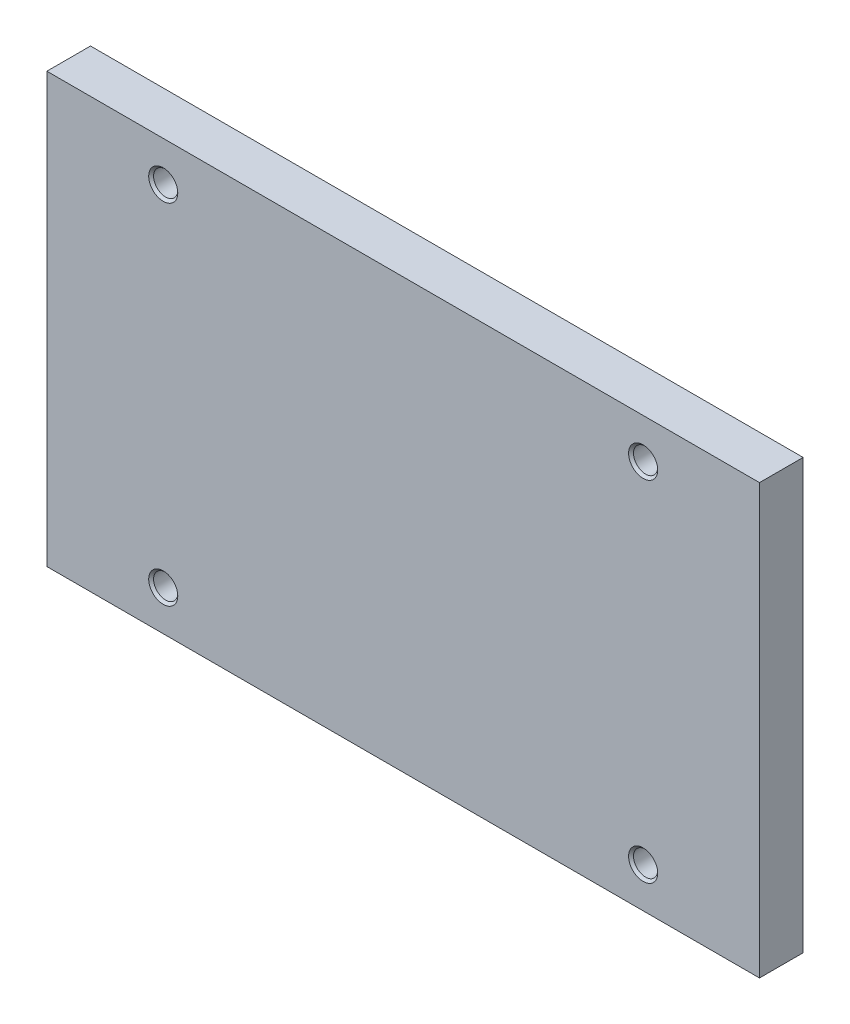
ISO-10303-21;
HEADER;
FILE_DESCRIPTION(('STEP AP214'),'2;1');
FILE_NAME('part.step','',(''),(''),'','','');
FILE_SCHEMA(('AUTOMOTIVE_DESIGN { 1 0 10303 214 1 1 1 1 }'));
ENDSEC;
DATA;
#1=APPLICATION_CONTEXT('core data for automotive mechanical design processes');
#2=APPLICATION_PROTOCOL_DEFINITION('international standard','automotive_design',2000,#1);
#3=PRODUCT_CONTEXT('',#1,'mechanical');
#4=PRODUCT('Part','Part','',(#3));
#5=PRODUCT_RELATED_PRODUCT_CATEGORY('part','',(#4));
#6=PRODUCT_DEFINITION_FORMATION('','',#4);
#7=PRODUCT_DEFINITION_CONTEXT('part definition',#1,'design');
#8=PRODUCT_DEFINITION('design','',#6,#7);
#9=PRODUCT_DEFINITION_SHAPE('','',#8);
#10=(LENGTH_UNIT() NAMED_UNIT(*) SI_UNIT(.MILLI.,.METRE.));
#11=(NAMED_UNIT(*) PLANE_ANGLE_UNIT() SI_UNIT($,.RADIAN.));
#12=(NAMED_UNIT(*) SI_UNIT($,.STERADIAN.) SOLID_ANGLE_UNIT());
#13=UNCERTAINTY_MEASURE_WITH_UNIT(LENGTH_MEASURE(1.E-05),#10,'distance_accuracy_value','');
#14=(GEOMETRIC_REPRESENTATION_CONTEXT(3) GLOBAL_UNCERTAINTY_ASSIGNED_CONTEXT((#13)) GLOBAL_UNIT_ASSIGNED_CONTEXT((#10,
#11,#12)) REPRESENTATION_CONTEXT('',''));
#15=CARTESIAN_POINT('',(0.,0.,0.));
#16=DIRECTION('',(0.,0.,1.));
#17=DIRECTION('',(1.,0.,0.));
#18=AXIS2_PLACEMENT_3D('',#15,#16,#17);
#19=CARTESIAN_POINT('',(98.,-59.,0.));
#20=DIRECTION('',(1.,0.,0.));
#21=DIRECTION('',(0.,0.,-1.));
#22=AXIS2_PLACEMENT_3D('',#19,#20,#21);
#23=PLANE('',#22);
#24=DIRECTION('',(0.,1.,0.));
#25=VECTOR('',#24,1.);
#26=CARTESIAN_POINT('',(98.,-59.,12.));
#27=LINE('',#26,#25);
#28=CARTESIAN_POINT('',(98.,-59.,12.));
#29=VERTEX_POINT('',#28);
#30=CARTESIAN_POINT('',(98.,59.,12.));
#31=VERTEX_POINT('',#30);
#32=EDGE_CURVE('E108',#29,#31,#27,.T.);
#33=ORIENTED_EDGE('',*,*,#32,.F.);
#34=DIRECTION('',(0.,0.,1.));
#35=VECTOR('',#34,1.);
#36=CARTESIAN_POINT('',(98.,-59.,0.));
#37=LINE('',#36,#35);
#38=CARTESIAN_POINT('',(98.,-59.,0.));
#39=VERTEX_POINT('',#38);
#40=EDGE_CURVE('E57',#39,#29,#37,.T.);
#41=ORIENTED_EDGE('',*,*,#40,.F.);
#42=DIRECTION('',(0.,1.,0.));
#43=VECTOR('',#42,1.);
#44=CARTESIAN_POINT('',(98.,-59.,0.));
#45=LINE('',#44,#43);
#46=CARTESIAN_POINT('',(98.,59.,0.));
#47=VERTEX_POINT('',#46);
#48=EDGE_CURVE('E102',#39,#47,#45,.T.);
#49=ORIENTED_EDGE('',*,*,#48,.T.);
#50=DIRECTION('',(0.,0.,1.));
#51=VECTOR('',#50,1.);
#52=CARTESIAN_POINT('',(98.,59.,0.));
#53=LINE('',#52,#51);
#54=EDGE_CURVE('E85',#47,#31,#53,.T.);
#55=ORIENTED_EDGE('',*,*,#54,.T.);
#56=EDGE_LOOP('',(#33,#41,#49,#55));
#57=FACE_BOUND('',#56,.T.);
#58=ADVANCED_FACE('F39',(#57),#23,.T.);
#59=CARTESIAN_POINT('',(-98.,-59.,0.));
#60=DIRECTION('',(0.,-1.,0.));
#61=DIRECTION('',(0.,0.,-1.));
#62=AXIS2_PLACEMENT_3D('',#59,#60,#61);
#63=PLANE('',#62);
#64=DIRECTION('',(1.,0.,0.));
#65=VECTOR('',#64,1.);
#66=CARTESIAN_POINT('',(-98.,-59.,12.));
#67=LINE('',#66,#65);
#68=CARTESIAN_POINT('',(-98.,-59.,12.));
#69=VERTEX_POINT('',#68);
#70=EDGE_CURVE('E104',#69,#29,#67,.T.);
#71=ORIENTED_EDGE('',*,*,#70,.F.);
#72=DIRECTION('',(0.,0.,1.));
#73=VECTOR('',#72,1.);
#74=CARTESIAN_POINT('',(-98.,-59.,0.));
#75=LINE('',#74,#73);
#76=CARTESIAN_POINT('',(-98.,-59.,0.));
#77=VERTEX_POINT('',#76);
#78=EDGE_CURVE('E74',#77,#69,#75,.T.);
#79=ORIENTED_EDGE('',*,*,#78,.F.);
#80=DIRECTION('',(1.,0.,0.));
#81=VECTOR('',#80,1.);
#82=CARTESIAN_POINT('',(-98.,-59.,0.));
#83=LINE('',#82,#81);
#84=EDGE_CURVE('E99',#77,#39,#83,.T.);
#85=ORIENTED_EDGE('',*,*,#84,.T.);
#86=ORIENTED_EDGE('',*,*,#40,.T.);
#87=EDGE_LOOP('',(#71,#79,#85,#86));
#88=FACE_BOUND('',#87,.T.);
#89=ADVANCED_FACE('F175',(#88),#63,.T.);
#90=CARTESIAN_POINT('',(-98.,59.,0.));
#91=DIRECTION('',(-1.,0.,0.));
#92=DIRECTION('',(0.,0.,1.));
#93=AXIS2_PLACEMENT_3D('',#90,#91,#92);
#94=PLANE('',#93);
#95=DIRECTION('',(0.,-1.,0.));
#96=VECTOR('',#95,1.);
#97=CARTESIAN_POINT('',(-98.,59.,12.));
#98=LINE('',#97,#96);
#99=CARTESIAN_POINT('',(-98.,59.,12.));
#100=VERTEX_POINT('',#99);
#101=EDGE_CURVE('E93',#100,#69,#98,.T.);
#102=ORIENTED_EDGE('',*,*,#101,.F.);
#103=DIRECTION('',(0.,0.,1.));
#104=VECTOR('',#103,1.);
#105=CARTESIAN_POINT('',(-98.,59.,0.));
#106=LINE('',#105,#104);
#107=CARTESIAN_POINT('',(-98.,59.,0.));
#108=VERTEX_POINT('',#107);
#109=EDGE_CURVE('E88',#108,#100,#106,.T.);
#110=ORIENTED_EDGE('',*,*,#109,.F.);
#111=DIRECTION('',(0.,-1.,0.));
#112=VECTOR('',#111,1.);
#113=CARTESIAN_POINT('',(-98.,59.,0.));
#114=LINE('',#113,#112);
#115=EDGE_CURVE('E91',#108,#77,#114,.T.);
#116=ORIENTED_EDGE('',*,*,#115,.T.);
#117=ORIENTED_EDGE('',*,*,#78,.T.);
#118=EDGE_LOOP('',(#102,#110,#116,#117));
#119=FACE_BOUND('',#118,.T.);
#120=ADVANCED_FACE('F90',(#119),#94,.T.);
#121=CARTESIAN_POINT('',(98.,59.,0.));
#122=DIRECTION('',(0.,1.,0.));
#123=DIRECTION('',(0.,0.,1.));
#124=AXIS2_PLACEMENT_3D('',#121,#122,#123);
#125=PLANE('',#124);
#126=DIRECTION('',(-1.,0.,0.));
#127=VECTOR('',#126,1.);
#128=CARTESIAN_POINT('',(98.,59.,12.));
#129=LINE('',#128,#127);
#130=EDGE_CURVE('E111',#31,#100,#129,.T.);
#131=ORIENTED_EDGE('',*,*,#130,.F.);
#132=ORIENTED_EDGE('',*,*,#54,.F.);
#133=DIRECTION('',(-1.,0.,0.));
#134=VECTOR('',#133,1.);
#135=CARTESIAN_POINT('',(98.,59.,0.));
#136=LINE('',#135,#134);
#137=EDGE_CURVE('E98',#47,#108,#136,.T.);
#138=ORIENTED_EDGE('',*,*,#137,.T.);
#139=ORIENTED_EDGE('',*,*,#109,.T.);
#140=EDGE_LOOP('',(#131,#132,#138,#139));
#141=FACE_BOUND('',#140,.T.);
#142=ADVANCED_FACE('F101',(#141),#125,.T.);
#143=CARTESIAN_POINT('',(0.,0.,0.));
#144=DIRECTION('',(0.,0.,1.));
#145=DIRECTION('',(1.,0.,0.));
#146=AXIS2_PLACEMENT_3D('',#143,#144,#145);
#147=PLANE('',#146);
#148=CARTESIAN_POINT('',(66.,48.,0.));
#149=DIRECTION('',(0.,0.,1.));
#150=DIRECTION('',(1.,0.,0.));
#151=AXIS2_PLACEMENT_3D('',#148,#149,#150);
#152=CIRCLE('',#151,4.00000000000003);
#153=CARTESIAN_POINT('',(62.,48.,0.));
#154=VERTEX_POINT('',#153);
#155=EDGE_CURVE('E146',#154,#154,#152,.T.);
#156=ORIENTED_EDGE('',*,*,#155,.T.);
#157=EDGE_LOOP('',(#156));
#158=FACE_BOUND('',#157,.T.);
#159=CARTESIAN_POINT('',(-66.,48.,0.));
#160=DIRECTION('',(0.,0.,1.));
#161=DIRECTION('',(1.,0.,0.));
#162=AXIS2_PLACEMENT_3D('',#159,#160,#161);
#163=CIRCLE('',#162,4.00000000000003);
#164=CARTESIAN_POINT('',(-70.,48.,0.));
#165=VERTEX_POINT('',#164);
#166=EDGE_CURVE('E143',#165,#165,#163,.T.);
#167=ORIENTED_EDGE('',*,*,#166,.T.);
#168=EDGE_LOOP('',(#167));
#169=FACE_BOUND('',#168,.T.);
#170=CARTESIAN_POINT('',(66.,-48.,0.));
#171=DIRECTION('',(0.,0.,1.));
#172=DIRECTION('',(1.,0.,0.));
#173=AXIS2_PLACEMENT_3D('',#170,#171,#172);
#174=CIRCLE('',#173,4.);
#175=CARTESIAN_POINT('',(70.,-48.,0.));
#176=VERTEX_POINT('',#175);
#177=EDGE_CURVE('E140',#176,#176,#174,.T.);
#178=ORIENTED_EDGE('',*,*,#177,.T.);
#179=EDGE_LOOP('',(#178));
#180=FACE_BOUND('',#179,.T.);
#181=CARTESIAN_POINT('',(-66.,-48.,0.));
#182=DIRECTION('',(0.,0.,1.));
#183=DIRECTION('',(1.,0.,0.));
#184=AXIS2_PLACEMENT_3D('',#181,#182,#183);
#185=CIRCLE('',#184,4.00000000000003);
#186=CARTESIAN_POINT('',(-70.,-48.,0.));
#187=VERTEX_POINT('',#186);
#188=EDGE_CURVE('E137',#187,#187,#185,.T.);
#189=ORIENTED_EDGE('',*,*,#188,.T.);
#190=EDGE_LOOP('',(#189));
#191=FACE_BOUND('',#190,.T.);
#192=ORIENTED_EDGE('',*,*,#48,.F.);
#193=ORIENTED_EDGE('',*,*,#84,.F.);
#194=ORIENTED_EDGE('',*,*,#115,.F.);
#195=ORIENTED_EDGE('',*,*,#137,.F.);
#196=EDGE_LOOP('',(#192,#193,#194,#195));
#197=FACE_BOUND('',#196,.T.);
#198=ADVANCED_FACE('F97',(#158,#169,#180,#191,#197),#147,.F.);
#199=CARTESIAN_POINT('',(0.,0.,12.));
#200=DIRECTION('',(0.,0.,1.));
#201=DIRECTION('',(1.,0.,0.));
#202=AXIS2_PLACEMENT_3D('',#199,#200,#201);
#203=PLANE('',#202);
#204=CARTESIAN_POINT('',(66.,-48.,12.));
#205=DIRECTION('',(0.,0.,1.));
#206=DIRECTION('',(1.,0.,0.));
#207=AXIS2_PLACEMENT_3D('',#204,#205,#206);
#208=CIRCLE('',#207,4.00000000000003);
#209=CARTESIAN_POINT('',(70.,-48.,12.));
#210=VERTEX_POINT('',#209);
#211=EDGE_CURVE('E128',#210,#210,#208,.F.);
#212=ORIENTED_EDGE('',*,*,#211,.T.);
#213=EDGE_LOOP('',(#212));
#214=FACE_BOUND('',#213,.T.);
#215=CARTESIAN_POINT('',(66.,48.,12.));
#216=DIRECTION('',(0.,0.,1.));
#217=DIRECTION('',(1.,0.,0.));
#218=AXIS2_PLACEMENT_3D('',#215,#216,#217);
#219=CIRCLE('',#218,3.99999999999998);
#220=CARTESIAN_POINT('',(70.,48.,12.));
#221=VERTEX_POINT('',#220);
#222=EDGE_CURVE('E125',#221,#221,#219,.F.);
#223=ORIENTED_EDGE('',*,*,#222,.T.);
#224=EDGE_LOOP('',(#223));
#225=FACE_BOUND('',#224,.T.);
#226=CARTESIAN_POINT('',(-66.,48.,12.));
#227=DIRECTION('',(0.,0.,1.));
#228=DIRECTION('',(1.,0.,0.));
#229=AXIS2_PLACEMENT_3D('',#226,#227,#228);
#230=CIRCLE('',#229,3.99999999999998);
#231=CARTESIAN_POINT('',(-62.,48.,12.));
#232=VERTEX_POINT('',#231);
#233=EDGE_CURVE('E122',#232,#232,#230,.F.);
#234=ORIENTED_EDGE('',*,*,#233,.T.);
#235=EDGE_LOOP('',(#234));
#236=FACE_BOUND('',#235,.T.);
#237=CARTESIAN_POINT('',(-66.,-48.,12.));
#238=DIRECTION('',(0.,0.,1.));
#239=DIRECTION('',(1.,0.,0.));
#240=AXIS2_PLACEMENT_3D('',#237,#238,#239);
#241=CIRCLE('',#240,3.99999999999998);
#242=CARTESIAN_POINT('',(-62.,-48.,12.));
#243=VERTEX_POINT('',#242);
#244=EDGE_CURVE('E117',#243,#243,#241,.F.);
#245=ORIENTED_EDGE('',*,*,#244,.T.);
#246=EDGE_LOOP('',(#245));
#247=FACE_BOUND('',#246,.T.);
#248=ORIENTED_EDGE('',*,*,#32,.T.);
#249=ORIENTED_EDGE('',*,*,#130,.T.);
#250=ORIENTED_EDGE('',*,*,#101,.T.);
#251=ORIENTED_EDGE('',*,*,#70,.T.);
#252=EDGE_LOOP('',(#248,#249,#250,#251));
#253=FACE_BOUND('',#252,.T.);
#254=ADVANCED_FACE('F237',(#214,#225,#236,#247,#253),#203,.T.);
#255=CARTESIAN_POINT('',(66.,-48.,0.));
#256=DIRECTION('',(0.,0.,-1.));
#257=DIRECTION('',(-1.,0.,0.));
#258=AXIS2_PLACEMENT_3D('',#255,#256,#257);
#259=CYLINDRICAL_SURFACE('',#258,3.32349999999999);
#260=CARTESIAN_POINT('',(66.,-48.,11.3234999999999));
#261=DIRECTION('',(0.,0.,1.));
#262=DIRECTION('',(1.,0.,0.));
#263=AXIS2_PLACEMENT_3D('',#260,#261,#262);
#264=CIRCLE('',#263,3.32349999999999);
#265=CARTESIAN_POINT('',(69.3235,-48.,11.3234999999999));
#266=VERTEX_POINT('',#265);
#267=EDGE_CURVE('E134',#266,#266,#264,.T.);
#268=ORIENTED_EDGE('',*,*,#267,.T.);
#269=EDGE_LOOP('',(#268));
#270=FACE_BOUND('',#269,.T.);
#271=CARTESIAN_POINT('',(66.,-48.,0.676499999999992));
#272=DIRECTION('',(0.,0.,1.));
#273=DIRECTION('',(1.,0.,0.));
#274=AXIS2_PLACEMENT_3D('',#271,#272,#273);
#275=CIRCLE('',#274,3.32349999999999);
#276=CARTESIAN_POINT('',(69.3235,-48.,0.676499999999992));
#277=VERTEX_POINT('',#276);
#278=EDGE_CURVE('E131',#277,#277,#275,.F.);
#279=ORIENTED_EDGE('',*,*,#278,.T.);
#280=EDGE_LOOP('',(#279));
#281=FACE_BOUND('',#280,.T.);
#282=ADVANCED_FACE('F244',(#270,#281),#259,.F.);
#283=CARTESIAN_POINT('',(66.,48.,12.));
#284=DIRECTION('',(0.,0.,1.));
#285=DIRECTION('',(1.,0.,0.));
#286=AXIS2_PLACEMENT_3D('',#283,#284,#285);
#287=CYLINDRICAL_SURFACE('',#286,3.32349999999999);
#288=CARTESIAN_POINT('',(66.,48.,0.676500000000052));
#289=DIRECTION('',(0.,0.,1.));
#290=DIRECTION('',(1.,0.,0.));
#291=AXIS2_PLACEMENT_3D('',#288,#289,#290);
#292=CIRCLE('',#291,3.32349999999999);
#293=CARTESIAN_POINT('',(62.6765,48.,0.676500000000052));
#294=VERTEX_POINT('',#293);
#295=EDGE_CURVE('E152',#294,#294,#292,.F.);
#296=ORIENTED_EDGE('',*,*,#295,.T.);
#297=EDGE_LOOP('',(#296));
#298=FACE_BOUND('',#297,.T.);
#299=CARTESIAN_POINT('',(66.,48.,11.3235));
#300=DIRECTION('',(0.,0.,1.));
#301=DIRECTION('',(1.,0.,0.));
#302=AXIS2_PLACEMENT_3D('',#299,#300,#301);
#303=CIRCLE('',#302,3.32349999999999);
#304=CARTESIAN_POINT('',(69.3235,48.,11.3235));
#305=VERTEX_POINT('',#304);
#306=EDGE_CURVE('E149',#305,#305,#303,.T.);
#307=ORIENTED_EDGE('',*,*,#306,.T.);
#308=EDGE_LOOP('',(#307));
#309=FACE_BOUND('',#308,.T.);
#310=ADVANCED_FACE('F278',(#298,#309),#287,.F.);
#311=CARTESIAN_POINT('',(-66.,-48.,12.));
#312=DIRECTION('',(0.,0.,1.));
#313=DIRECTION('',(1.,0.,0.));
#314=AXIS2_PLACEMENT_3D('',#311,#312,#313);
#315=CYLINDRICAL_SURFACE('',#314,3.32349999999999);
#316=CARTESIAN_POINT('',(-66.,-48.,0.676500000000052));
#317=DIRECTION('',(0.,0.,1.));
#318=DIRECTION('',(1.,0.,0.));
#319=AXIS2_PLACEMENT_3D('',#316,#317,#318);
#320=CIRCLE('',#319,3.32349999999999);
#321=CARTESIAN_POINT('',(-69.3235,-48.,0.676500000000052));
#322=VERTEX_POINT('',#321);
#323=EDGE_CURVE('E11',#322,#322,#320,.F.);
#324=ORIENTED_EDGE('',*,*,#323,.T.);
#325=EDGE_LOOP('',(#324));
#326=FACE_BOUND('',#325,.T.);
#327=CARTESIAN_POINT('',(-66.,-48.,11.3235));
#328=DIRECTION('',(0.,0.,1.));
#329=DIRECTION('',(1.,0.,0.));
#330=AXIS2_PLACEMENT_3D('',#327,#328,#329);
#331=CIRCLE('',#330,3.32349999999999);
#332=CARTESIAN_POINT('',(-62.6765,-48.,11.3235));
#333=VERTEX_POINT('',#332);
#334=EDGE_CURVE('E49',#333,#333,#331,.T.);
#335=ORIENTED_EDGE('',*,*,#334,.T.);
#336=EDGE_LOOP('',(#335));
#337=FACE_BOUND('',#336,.T.);
#338=ADVANCED_FACE('F163',(#326,#337),#315,.F.);
#339=CARTESIAN_POINT('',(-66.,48.,12.));
#340=DIRECTION('',(0.,0.,1.));
#341=DIRECTION('',(1.,0.,0.));
#342=AXIS2_PLACEMENT_3D('',#339,#340,#341);
#343=CYLINDRICAL_SURFACE('',#342,3.32349999999999);
#344=CARTESIAN_POINT('',(-66.,48.,0.676500000000052));
#345=DIRECTION('',(0.,0.,1.));
#346=DIRECTION('',(1.,0.,0.));
#347=AXIS2_PLACEMENT_3D('',#344,#345,#346);
#348=CIRCLE('',#347,3.32349999999999);
#349=CARTESIAN_POINT('',(-69.3235,48.,0.676500000000052));
#350=VERTEX_POINT('',#349);
#351=EDGE_CURVE('E158',#350,#350,#348,.F.);
#352=ORIENTED_EDGE('',*,*,#351,.T.);
#353=EDGE_LOOP('',(#352));
#354=FACE_BOUND('',#353,.T.);
#355=CARTESIAN_POINT('',(-66.,48.,11.3235));
#356=DIRECTION('',(0.,0.,1.));
#357=DIRECTION('',(1.,0.,0.));
#358=AXIS2_PLACEMENT_3D('',#355,#356,#357);
#359=CIRCLE('',#358,3.32349999999999);
#360=CARTESIAN_POINT('',(-62.6765,48.,11.3235));
#361=VERTEX_POINT('',#360);
#362=EDGE_CURVE('E155',#361,#361,#359,.T.);
#363=ORIENTED_EDGE('',*,*,#362,.T.);
#364=EDGE_LOOP('',(#363));
#365=FACE_BOUND('',#364,.T.);
#366=ADVANCED_FACE('F192',(#354,#365),#343,.F.);
#367=CARTESIAN_POINT('',(66.,-48.,12.));
#368=DIRECTION('',(0.,0.,1.));
#369=DIRECTION('',(1.,0.,0.));
#370=AXIS2_PLACEMENT_3D('',#367,#368,#369);
#371=CONICAL_SURFACE('',#370,4.00000000000003,0.785398163397438);
#372=CARTESIAN_POINT('',(69.3235,-48.,11.3234999999999));
#373=CARTESIAN_POINT('',(69.330546875,-48.,11.3305468749999));
#374=CARTESIAN_POINT('',(69.33759375,-48.,11.3375937499999));
#375=CARTESIAN_POINT('',(69.3516875,-48.,11.3516874999999));
#376=CARTESIAN_POINT('',(69.358734375,-48.,11.3587343749999));
#377=CARTESIAN_POINT('',(69.372828125,-48.,11.372828125));
#378=CARTESIAN_POINT('',(69.379875,-48.,11.379875));
#379=CARTESIAN_POINT('',(69.39396875,-48.,11.39396875));
#380=CARTESIAN_POINT('',(69.401015625,-48.,11.401015625));
#381=CARTESIAN_POINT('',(69.415109375,-48.,11.415109375));
#382=CARTESIAN_POINT('',(69.42215625,-48.,11.42215625));
#383=CARTESIAN_POINT('',(69.43625,-48.,11.43625));
#384=CARTESIAN_POINT('',(69.443296875,-48.,11.443296875));
#385=CARTESIAN_POINT('',(69.457390625,-48.,11.457390625));
#386=CARTESIAN_POINT('',(69.4644375,-48.,11.4644375));
#387=CARTESIAN_POINT('',(69.47853125,-48.,11.47853125));
#388=CARTESIAN_POINT('',(69.485578125,-48.,11.485578125));
#389=CARTESIAN_POINT('',(69.499671875,-48.,11.499671875));
#390=CARTESIAN_POINT('',(69.50671875,-48.,11.50671875));
#391=CARTESIAN_POINT('',(69.5208125,-48.,11.5208125));
#392=CARTESIAN_POINT('',(69.527859375,-48.,11.527859375));
#393=CARTESIAN_POINT('',(69.541953125,-48.,11.541953125));
#394=CARTESIAN_POINT('',(69.549,-48.,11.549));
#395=CARTESIAN_POINT('',(69.56309375,-48.,11.56309375));
#396=CARTESIAN_POINT('',(69.570140625,-48.,11.570140625));
#397=CARTESIAN_POINT('',(69.584234375,-48.,11.584234375));
#398=CARTESIAN_POINT('',(69.59128125,-48.,11.59128125));
#399=CARTESIAN_POINT('',(69.605375,-48.,11.605375));
#400=CARTESIAN_POINT('',(69.612421875,-48.,11.612421875));
#401=CARTESIAN_POINT('',(69.626515625,-48.,11.626515625));
#402=CARTESIAN_POINT('',(69.6335625,-48.,11.6335625));
#403=CARTESIAN_POINT('',(69.64765625,-48.,11.64765625));
#404=CARTESIAN_POINT('',(69.654703125,-48.,11.654703125));
#405=CARTESIAN_POINT('',(69.668796875,-48.,11.668796875));
#406=CARTESIAN_POINT('',(69.67584375,-48.,11.67584375));
#407=CARTESIAN_POINT('',(69.6899375,-48.,11.6899375));
#408=CARTESIAN_POINT('',(69.696984375,-48.,11.696984375));
#409=CARTESIAN_POINT('',(69.711078125,-48.,11.711078125));
#410=CARTESIAN_POINT('',(69.718125,-48.,11.718125));
#411=CARTESIAN_POINT('',(69.73221875,-48.,11.73221875));
#412=CARTESIAN_POINT('',(69.739265625,-48.,11.739265625));
#413=CARTESIAN_POINT('',(69.753359375,-48.,11.753359375));
#414=CARTESIAN_POINT('',(69.76040625,-48.,11.76040625));
#415=CARTESIAN_POINT('',(69.7745,-48.,11.7745));
#416=CARTESIAN_POINT('',(69.781546875,-48.,11.781546875));
#417=CARTESIAN_POINT('',(69.795640625,-48.,11.795640625));
#418=CARTESIAN_POINT('',(69.8026875,-48.,11.8026875));
#419=CARTESIAN_POINT('',(69.81678125,-48.,11.81678125));
#420=CARTESIAN_POINT('',(69.823828125,-48.,11.823828125));
#421=CARTESIAN_POINT('',(69.837921875,-48.,11.837921875));
#422=CARTESIAN_POINT('',(69.84496875,-48.,11.84496875));
#423=CARTESIAN_POINT('',(69.8590625,-48.,11.8590625));
#424=CARTESIAN_POINT('',(69.866109375,-48.,11.866109375));
#425=CARTESIAN_POINT('',(69.880203125,-48.,11.880203125));
#426=CARTESIAN_POINT('',(69.88725,-48.,11.88725));
#427=CARTESIAN_POINT('',(69.90134375,-48.,11.90134375));
#428=CARTESIAN_POINT('',(69.908390625,-48.,11.908390625));
#429=CARTESIAN_POINT('',(69.922484375,-48.,11.922484375));
#430=CARTESIAN_POINT('',(69.92953125,-48.,11.92953125));
#431=CARTESIAN_POINT('',(69.943625,-48.,11.943625));
#432=CARTESIAN_POINT('',(69.950671875,-48.,11.950671875));
#433=CARTESIAN_POINT('',(69.964765625,-48.,11.964765625));
#434=CARTESIAN_POINT('',(69.9718125,-48.,11.9718125));
#435=CARTESIAN_POINT('',(69.98590625,-48.,11.98590625));
#436=CARTESIAN_POINT('',(69.992953125,-48.,11.992953125));
#437=CARTESIAN_POINT('',(70.,-48.,12.));
#438=B_SPLINE_CURVE_WITH_KNOTS('',3,(#372,#373,#374,#375,#376,#377,#378,#379,#380,#381,#382,
#383,#384,#385,#386,#387,#388,#389,#390,#391,#392,#393,#394,#395,#396,#397,#398,#399,#400,#401,
#402,#403,#404,#405,#406,#407,#408,#409,#410,#411,#412,#413,#414,#415,#416,#417,#418,#419,#420,
#421,#422,#423,#424,#425,#426,#427,#428,#429,#430,#431,#432,#433,#434,#435,#436,#437),
.UNSPECIFIED.,.F.,.F.,(4,2,2,2,2,2,2,2,2,2,2,2,2,2,2,2,2,2,2,2,2,2,2,2,2,2,2,2,2,2,2,2,4),(0.,
0.0298973585920448,0.0597947171840883,0.0896920757761331,0.119589434368187,0.149486792960231,
0.179384151552275,0.20928151014432,0.239178868736363,0.269076227328408,0.298973585920452,
0.328870944512506,0.35876830310455,0.388665661696594,0.418563020288638,0.448460378880683,
0.478357737472726,0.508255096064781,0.538152454656824,0.568049813248869,0.597947171840913,
0.627844530432958,0.657741889025001,0.687639247617056,0.717536606209101,0.747433964801144,
0.777331323393189,0.807228681985232,0.837126040577277,0.867023399169331,0.896920757761375,
0.926818116353419,0.956715474945464),.UNSPECIFIED.);
#439=EDGE_CURVE('BSEAM185',#266,#210,#438,.T.);
#440=ORIENTED_EDGE('',*,*,#267,.F.);
#441=ORIENTED_EDGE('',*,*,#211,.F.);
#442=ORIENTED_EDGE('',*,*,#439,.T.);
#443=ORIENTED_EDGE('',*,*,#439,.F.);
#444=EDGE_LOOP('',(#440,#442,#441,#443));
#445=FACE_BOUND('',#444,.T.);
#446=ADVANCED_FACE('F185',(#445),#371,.F.);
#447=CARTESIAN_POINT('',(66.,48.,0.));
#448=DIRECTION('',(0.,0.,-1.));
#449=DIRECTION('',(-1.,0.,0.));
#450=AXIS2_PLACEMENT_3D('',#447,#448,#449);
#451=CONICAL_SURFACE('',#450,4.00000000000003,0.785398163397438);
#452=CARTESIAN_POINT('',(62.6765,48.,0.676500000000052));
#453=CARTESIAN_POINT('',(62.669453125,48.,0.669453125000051));
#454=CARTESIAN_POINT('',(62.66240625,48.,0.662406250000051));
#455=CARTESIAN_POINT('',(62.6483125,48.,0.64831250000005));
#456=CARTESIAN_POINT('',(62.641265625,48.,0.64126562500005));
#457=CARTESIAN_POINT('',(62.627171875,48.,0.627171875000048));
#458=CARTESIAN_POINT('',(62.620125,48.,0.620125000000046));
#459=CARTESIAN_POINT('',(62.60603125,48.,0.606031250000046));
#460=CARTESIAN_POINT('',(62.598984375,48.,0.598984375000047));
#461=CARTESIAN_POINT('',(62.584890625,48.,0.584890625000046));
#462=CARTESIAN_POINT('',(62.57784375,48.,0.577843750000045));
#463=CARTESIAN_POINT('',(62.56375,48.,0.563750000000043));
#464=CARTESIAN_POINT('',(62.556703125,48.,0.556703125000043));
#465=CARTESIAN_POINT('',(62.542609375,48.,0.542609375000042));
#466=CARTESIAN_POINT('',(62.5355625,48.,0.535562500000041));
#467=CARTESIAN_POINT('',(62.52146875,48.,0.52146875000004));
#468=CARTESIAN_POINT('',(62.514421875,48.,0.514421875000039));
#469=CARTESIAN_POINT('',(62.500328125,48.,0.500328125000038));
#470=CARTESIAN_POINT('',(62.49328125,48.,0.493281250000038));
#471=CARTESIAN_POINT('',(62.4791875,48.,0.479187500000038));
#472=CARTESIAN_POINT('',(62.472140625,48.,0.472140625000037));
#473=CARTESIAN_POINT('',(62.458046875,48.,0.458046875000035));
#474=CARTESIAN_POINT('',(62.451,48.,0.451000000000034));
#475=CARTESIAN_POINT('',(62.43690625,48.,0.436906250000033));
#476=CARTESIAN_POINT('',(62.429859375,48.,0.429859375000033));
#477=CARTESIAN_POINT('',(62.415765625,48.,0.415765625000033));
#478=CARTESIAN_POINT('',(62.40871875,48.,0.408718750000032));
#479=CARTESIAN_POINT('',(62.394625,48.,0.39462500000003));
#480=CARTESIAN_POINT('',(62.387578125,48.,0.387578125000029));
#481=CARTESIAN_POINT('',(62.373484375,48.,0.373484375000028));
#482=CARTESIAN_POINT('',(62.3664375,48.,0.366437500000029));
#483=CARTESIAN_POINT('',(62.35234375,48.,0.352343750000028));
#484=CARTESIAN_POINT('',(62.345296875,48.,0.345296875000027));
#485=CARTESIAN_POINT('',(62.331203125,48.,0.331203125000025));
#486=CARTESIAN_POINT('',(62.32415625,48.,0.324156250000024));
#487=CARTESIAN_POINT('',(62.3100625,48.,0.310062500000023));
#488=CARTESIAN_POINT('',(62.303015625,48.,0.303015625000024));
#489=CARTESIAN_POINT('',(62.288921875,48.,0.288921875000023));
#490=CARTESIAN_POINT('',(62.281875,48.,0.281875000000022));
#491=CARTESIAN_POINT('',(62.26778125,48.,0.26778125000002));
#492=CARTESIAN_POINT('',(62.260734375,48.,0.260734375000019));
#493=CARTESIAN_POINT('',(62.246640625,48.,0.246640625000019));
#494=CARTESIAN_POINT('',(62.23959375,48.,0.239593750000019));
#495=CARTESIAN_POINT('',(62.2255,48.,0.225500000000018));
#496=CARTESIAN_POINT('',(62.218453125,48.,0.218453125000017));
#497=CARTESIAN_POINT('',(62.204359375,48.,0.204359375000015));
#498=CARTESIAN_POINT('',(62.1973125,48.,0.197312500000014));
#499=CARTESIAN_POINT('',(62.18321875,48.,0.183218750000014));
#500=CARTESIAN_POINT('',(62.176171875,48.,0.176171875000014));
#501=CARTESIAN_POINT('',(62.162078125,48.,0.162078125000013));
#502=CARTESIAN_POINT('',(62.15503125,48.,0.155031250000012));
#503=CARTESIAN_POINT('',(62.1409375,48.,0.140937500000011));
#504=CARTESIAN_POINT('',(62.133890625,48.,0.13389062500001));
#505=CARTESIAN_POINT('',(62.119796875,48.,0.119796875000009));
#506=CARTESIAN_POINT('',(62.11275,48.,0.112750000000008));
#507=CARTESIAN_POINT('',(62.09865625,48.,0.0986562500000071));
#508=CARTESIAN_POINT('',(62.091609375,48.,0.0916093750000074));
#509=CARTESIAN_POINT('',(62.077515625,48.,0.0775156250000067));
#510=CARTESIAN_POINT('',(62.07046875,48.,0.0704687500000058));
#511=CARTESIAN_POINT('',(62.056375,48.,0.056375000000004));
#512=CARTESIAN_POINT('',(62.049328125,48.,0.0493281250000031));
#513=CARTESIAN_POINT('',(62.035234375,48.,0.0352343750000022));
#514=CARTESIAN_POINT('',(62.0281875,48.,0.0281875000000022));
#515=CARTESIAN_POINT('',(62.01409375,48.,0.0140937500000022));
#516=CARTESIAN_POINT('',(62.007046875,48.,0.00704687500000217));
#517=CARTESIAN_POINT('',(62.,48.,0.));
#518=B_SPLINE_CURVE_WITH_KNOTS('',3,(#452,#453,#454,#455,#456,#457,#458,#459,#460,#461,#462,
#463,#464,#465,#466,#467,#468,#469,#470,#471,#472,#473,#474,#475,#476,#477,#478,#479,#480,#481,
#482,#483,#484,#485,#486,#487,#488,#489,#490,#491,#492,#493,#494,#495,#496,#497,#498,#499,#500,
#501,#502,#503,#504,#505,#506,#507,#508,#509,#510,#511,#512,#513,#514,#515,#516,#517),
.UNSPECIFIED.,.F.,.F.,(4,2,2,2,2,2,2,2,2,2,2,2,2,2,2,2,2,2,2,2,2,2,2,2,2,2,2,2,2,2,2,2,4),(0.,
0.0298973585920442,0.0597947171840883,0.0896920757761325,0.119589434368187,0.149486792960231,
0.179384151552275,0.209281510144319,0.239178868736363,0.269076227328412,0.298973585920456,
0.328870944512501,0.35876830310455,0.388665661696594,0.418563020288638,0.448460378880687,
0.478357737472731,0.508255096064775,0.538152454656824,0.568049813248869,0.597947171840913,
0.627844530432962,0.657741889025006,0.68763924761705,0.717536606209099,0.747433964801143,
0.777331323393187,0.807228681985232,0.837126040577281,0.867023399169325,0.896920757761369,
0.926818116353418,0.956715474945462),.UNSPECIFIED.);
#519=EDGE_CURVE('BSEAM191',#294,#154,#518,.T.);
#520=ORIENTED_EDGE('',*,*,#295,.F.);
#521=ORIENTED_EDGE('',*,*,#155,.F.);
#522=ORIENTED_EDGE('',*,*,#519,.T.);
#523=ORIENTED_EDGE('',*,*,#519,.F.);
#524=EDGE_LOOP('',(#520,#522,#521,#523));
#525=FACE_BOUND('',#524,.T.);
#526=ADVANCED_FACE('F191',(#525),#451,.F.);
#527=CARTESIAN_POINT('',(66.,48.,11.3235));
#528=DIRECTION('',(0.,0.,1.));
#529=DIRECTION('',(1.,0.,0.));
#530=AXIS2_PLACEMENT_3D('',#527,#528,#529);
#531=CONICAL_SURFACE('',#530,3.32349999999999,0.785398163397446);
#532=ORIENTED_EDGE('',*,*,#222,.F.);
#533=EDGE_LOOP('',(#532));
#534=FACE_BOUND('',#533,.T.);
#535=ORIENTED_EDGE('',*,*,#306,.F.);
#536=EDGE_LOOP('',(#535));
#537=FACE_BOUND('',#536,.T.);
#538=ADVANCED_FACE('F199',(#534,#537),#531,.F.);
#539=CARTESIAN_POINT('',(-66.,48.,0.));
#540=DIRECTION('',(0.,0.,-1.));
#541=DIRECTION('',(-1.,0.,0.));
#542=AXIS2_PLACEMENT_3D('',#539,#540,#541);
#543=CONICAL_SURFACE('',#542,4.00000000000003,0.785398163397438);
#544=CARTESIAN_POINT('',(-69.3235,48.,0.676500000000052));
#545=CARTESIAN_POINT('',(-69.330546875,48.,0.669453125000051));
#546=CARTESIAN_POINT('',(-69.33759375,48.,0.662406250000051));
#547=CARTESIAN_POINT('',(-69.3516875,48.,0.64831250000005));
#548=CARTESIAN_POINT('',(-69.358734375,48.,0.64126562500005));
#549=CARTESIAN_POINT('',(-69.372828125,48.,0.627171875000048));
#550=CARTESIAN_POINT('',(-69.379875,48.,0.620125000000046));
#551=CARTESIAN_POINT('',(-69.39396875,48.,0.606031250000046));
#552=CARTESIAN_POINT('',(-69.401015625,48.,0.598984375000047));
#553=CARTESIAN_POINT('',(-69.415109375,48.,0.584890625000046));
#554=CARTESIAN_POINT('',(-69.42215625,48.,0.577843750000045));
#555=CARTESIAN_POINT('',(-69.43625,48.,0.563750000000043));
#556=CARTESIAN_POINT('',(-69.443296875,48.,0.556703125000043));
#557=CARTESIAN_POINT('',(-69.457390625,48.,0.542609375000042));
#558=CARTESIAN_POINT('',(-69.4644375,48.,0.535562500000041));
#559=CARTESIAN_POINT('',(-69.47853125,48.,0.52146875000004));
#560=CARTESIAN_POINT('',(-69.485578125,48.,0.51442187500004));
#561=CARTESIAN_POINT('',(-69.499671875,48.,0.500328125000038));
#562=CARTESIAN_POINT('',(-69.50671875,48.,0.493281250000036));
#563=CARTESIAN_POINT('',(-69.5208125,48.,0.479187500000036));
#564=CARTESIAN_POINT('',(-69.527859375,48.,0.472140625000037));
#565=CARTESIAN_POINT('',(-69.541953125,48.,0.458046875000037));
#566=CARTESIAN_POINT('',(-69.549,48.,0.451000000000035));
#567=CARTESIAN_POINT('',(-69.56309375,48.,0.436906250000033));
#568=CARTESIAN_POINT('',(-69.570140625,48.,0.429859375000033));
#569=CARTESIAN_POINT('',(-69.584234375,48.,0.415765625000032));
#570=CARTESIAN_POINT('',(-69.59128125,48.,0.408718750000031));
#571=CARTESIAN_POINT('',(-69.605375,48.,0.39462500000003));
#572=CARTESIAN_POINT('',(-69.612421875,48.,0.38757812500003));
#573=CARTESIAN_POINT('',(-69.626515625,48.,0.373484375000028));
#574=CARTESIAN_POINT('',(-69.6335625,48.,0.366437500000027));
#575=CARTESIAN_POINT('',(-69.64765625,48.,0.352343750000026));
#576=CARTESIAN_POINT('',(-69.654703125,48.,0.345296875000027));
#577=CARTESIAN_POINT('',(-69.668796875,48.,0.331203125000027));
#578=CARTESIAN_POINT('',(-69.67584375,48.,0.324156250000025));
#579=CARTESIAN_POINT('',(-69.6899375,48.,0.310062500000023));
#580=CARTESIAN_POINT('',(-69.696984375,48.,0.303015625000023));
#581=CARTESIAN_POINT('',(-69.711078125,48.,0.288921875000022));
#582=CARTESIAN_POINT('',(-69.718125,48.,0.281875000000022));
#583=CARTESIAN_POINT('',(-69.73221875,48.,0.267781250000021));
#584=CARTESIAN_POINT('',(-69.739265625,48.,0.26073437500002));
#585=CARTESIAN_POINT('',(-69.753359375,48.,0.246640625000019));
#586=CARTESIAN_POINT('',(-69.76040625,48.,0.239593750000019));
#587=CARTESIAN_POINT('',(-69.7745,48.,0.225500000000017));
#588=CARTESIAN_POINT('',(-69.781546875,48.,0.218453125000015));
#589=CARTESIAN_POINT('',(-69.795640625,48.,0.204359375000015));
#590=CARTESIAN_POINT('',(-69.8026875,48.,0.197312500000016));
#591=CARTESIAN_POINT('',(-69.81678125,48.,0.183218750000016));
#592=CARTESIAN_POINT('',(-69.823828125,48.,0.176171875000014));
#593=CARTESIAN_POINT('',(-69.837921875,48.,0.162078125000012));
#594=CARTESIAN_POINT('',(-69.84496875,48.,0.155031250000012));
#595=CARTESIAN_POINT('',(-69.8590625,48.,0.140937500000011));
#596=CARTESIAN_POINT('',(-69.866109375,48.,0.13389062500001));
#597=CARTESIAN_POINT('',(-69.880203125,48.,0.119796875000009));
#598=CARTESIAN_POINT('',(-69.88725,48.,0.112750000000009));
#599=CARTESIAN_POINT('',(-69.90134375,48.,0.0986562500000072));
#600=CARTESIAN_POINT('',(-69.908390625,48.,0.0916093750000056));
#601=CARTESIAN_POINT('',(-69.922484375,48.,0.0775156250000051));
#602=CARTESIAN_POINT('',(-69.92953125,48.,0.0704687500000063));
#603=CARTESIAN_POINT('',(-69.943625,48.,0.0563750000000058));
#604=CARTESIAN_POINT('',(-69.950671875,48.,0.0493281250000042));
#605=CARTESIAN_POINT('',(-69.964765625,48.,0.0352343750000023));
#606=CARTESIAN_POINT('',(-69.9718125,48.,0.028187500000002));
#607=CARTESIAN_POINT('',(-69.98590625,48.,0.0140937500000013));
#608=CARTESIAN_POINT('',(-69.992953125,48.,0.00704687500000097));
#609=CARTESIAN_POINT('',(-70.,48.,0.));
#610=B_SPLINE_CURVE_WITH_KNOTS('',3,(#544,#545,#546,#547,#548,#549,#550,#551,#552,#553,#554,
#555,#556,#557,#558,#559,#560,#561,#562,#563,#564,#565,#566,#567,#568,#569,#570,#571,#572,#573,
#574,#575,#576,#577,#578,#579,#580,#581,#582,#583,#584,#585,#586,#587,#588,#589,#590,#591,#592,
#593,#594,#595,#596,#597,#598,#599,#600,#601,#602,#603,#604,#605,#606,#607,#608,#609),
.UNSPECIFIED.,.F.,.F.,(4,2,2,2,2,2,2,2,2,2,2,2,2,2,2,2,2,2,2,2,2,2,2,2,2,2,2,2,2,2,2,2,4),(0.,
0.0298973585920442,0.0597947171840883,0.0896920757761325,0.119589434368187,0.149486792960231,
0.179384151552275,0.209281510144319,0.239178868736363,0.269076227328407,0.298973585920461,
0.328870944512505,0.35876830310455,0.388665661696594,0.418563020288638,0.448460378880682,
0.478357737472736,0.50825509606478,0.538152454656824,0.568049813248869,0.597947171840913,
0.627844530432957,0.657741889025001,0.687639247617055,0.717536606209099,0.747433964801143,
0.777331323393188,0.807228681985232,0.837126040577276,0.86702339916933,0.896920757761374,
0.926818116353418,0.956715474945462),.UNSPECIFIED.);
#611=EDGE_CURVE('BSEAM206',#350,#165,#610,.T.);
#612=ORIENTED_EDGE('',*,*,#351,.F.);
#613=ORIENTED_EDGE('',*,*,#166,.F.);
#614=ORIENTED_EDGE('',*,*,#611,.T.);
#615=ORIENTED_EDGE('',*,*,#611,.F.);
#616=EDGE_LOOP('',(#612,#614,#613,#615));
#617=FACE_BOUND('',#616,.T.);
#618=ADVANCED_FACE('F206',(#617),#543,.F.);
#619=CARTESIAN_POINT('',(66.,-48.,0.676499999999992));
#620=DIRECTION('',(0.,0.,-1.));
#621=DIRECTION('',(-1.,0.,0.));
#622=AXIS2_PLACEMENT_3D('',#619,#620,#621);
#623=CONICAL_SURFACE('',#622,3.32349999999999,0.785398163397462);
#624=ORIENTED_EDGE('',*,*,#177,.F.);
#625=EDGE_LOOP('',(#624));
#626=FACE_BOUND('',#625,.T.);
#627=ORIENTED_EDGE('',*,*,#278,.F.);
#628=EDGE_LOOP('',(#627));
#629=FACE_BOUND('',#628,.T.);
#630=ADVANCED_FACE('F213',(#626,#629),#623,.F.);
#631=CARTESIAN_POINT('',(-66.,-48.,0.));
#632=DIRECTION('',(0.,0.,-1.));
#633=DIRECTION('',(-1.,0.,0.));
#634=AXIS2_PLACEMENT_3D('',#631,#632,#633);
#635=CONICAL_SURFACE('',#634,4.00000000000003,0.785398163397438);
#636=CARTESIAN_POINT('',(-69.3235,-48.,0.676500000000052));
#637=CARTESIAN_POINT('',(-69.330546875,-48.,0.669453125000051));
#638=CARTESIAN_POINT('',(-69.33759375,-48.,0.662406250000051));
#639=CARTESIAN_POINT('',(-69.3516875,-48.,0.64831250000005));
#640=CARTESIAN_POINT('',(-69.358734375,-48.,0.64126562500005));
#641=CARTESIAN_POINT('',(-69.372828125,-48.,0.627171875000048));
#642=CARTESIAN_POINT('',(-69.379875,-48.,0.620125000000046));
#643=CARTESIAN_POINT('',(-69.39396875,-48.,0.606031250000046));
#644=CARTESIAN_POINT('',(-69.401015625,-48.,0.598984375000047));
#645=CARTESIAN_POINT('',(-69.415109375,-48.,0.584890625000046));
#646=CARTESIAN_POINT('',(-69.42215625,-48.,0.577843750000045));
#647=CARTESIAN_POINT('',(-69.43625,-48.,0.563750000000043));
#648=CARTESIAN_POINT('',(-69.443296875,-48.,0.556703125000043));
#649=CARTESIAN_POINT('',(-69.457390625,-48.,0.542609375000042));
#650=CARTESIAN_POINT('',(-69.4644375,-48.,0.535562500000041));
#651=CARTESIAN_POINT('',(-69.47853125,-48.,0.52146875000004));
#652=CARTESIAN_POINT('',(-69.485578125,-48.,0.51442187500004));
#653=CARTESIAN_POINT('',(-69.499671875,-48.,0.500328125000038));
#654=CARTESIAN_POINT('',(-69.50671875,-48.,0.493281250000036));
#655=CARTESIAN_POINT('',(-69.5208125,-48.,0.479187500000036));
#656=CARTESIAN_POINT('',(-69.527859375,-48.,0.472140625000037));
#657=CARTESIAN_POINT('',(-69.541953125,-48.,0.458046875000037));
#658=CARTESIAN_POINT('',(-69.549,-48.,0.451000000000035));
#659=CARTESIAN_POINT('',(-69.56309375,-48.,0.436906250000033));
#660=CARTESIAN_POINT('',(-69.570140625,-48.,0.429859375000033));
#661=CARTESIAN_POINT('',(-69.584234375,-48.,0.415765625000032));
#662=CARTESIAN_POINT('',(-69.59128125,-48.,0.408718750000031));
#663=CARTESIAN_POINT('',(-69.605375,-48.,0.39462500000003));
#664=CARTESIAN_POINT('',(-69.612421875,-48.,0.38757812500003));
#665=CARTESIAN_POINT('',(-69.626515625,-48.,0.373484375000028));
#666=CARTESIAN_POINT('',(-69.6335625,-48.,0.366437500000027));
#667=CARTESIAN_POINT('',(-69.64765625,-48.,0.352343750000026));
#668=CARTESIAN_POINT('',(-69.654703125,-48.,0.345296875000027));
#669=CARTESIAN_POINT('',(-69.668796875,-48.,0.331203125000027));
#670=CARTESIAN_POINT('',(-69.67584375,-48.,0.324156250000025));
#671=CARTESIAN_POINT('',(-69.6899375,-48.,0.310062500000023));
#672=CARTESIAN_POINT('',(-69.696984375,-48.,0.303015625000023));
#673=CARTESIAN_POINT('',(-69.711078125,-48.,0.288921875000022));
#674=CARTESIAN_POINT('',(-69.718125,-48.,0.281875000000022));
#675=CARTESIAN_POINT('',(-69.73221875,-48.,0.267781250000021));
#676=CARTESIAN_POINT('',(-69.739265625,-48.,0.26073437500002));
#677=CARTESIAN_POINT('',(-69.753359375,-48.,0.246640625000019));
#678=CARTESIAN_POINT('',(-69.76040625,-48.,0.239593750000019));
#679=CARTESIAN_POINT('',(-69.7745,-48.,0.225500000000017));
#680=CARTESIAN_POINT('',(-69.781546875,-48.,0.218453125000015));
#681=CARTESIAN_POINT('',(-69.795640625,-48.,0.204359375000015));
#682=CARTESIAN_POINT('',(-69.8026875,-48.,0.197312500000016));
#683=CARTESIAN_POINT('',(-69.81678125,-48.,0.183218750000016));
#684=CARTESIAN_POINT('',(-69.823828125,-48.,0.176171875000014));
#685=CARTESIAN_POINT('',(-69.837921875,-48.,0.162078125000012));
#686=CARTESIAN_POINT('',(-69.84496875,-48.,0.155031250000012));
#687=CARTESIAN_POINT('',(-69.8590625,-48.,0.140937500000011));
#688=CARTESIAN_POINT('',(-69.866109375,-48.,0.13389062500001));
#689=CARTESIAN_POINT('',(-69.880203125,-48.,0.119796875000009));
#690=CARTESIAN_POINT('',(-69.88725,-48.,0.112750000000009));
#691=CARTESIAN_POINT('',(-69.90134375,-48.,0.0986562500000072));
#692=CARTESIAN_POINT('',(-69.908390625,-48.,0.0916093750000056));
#693=CARTESIAN_POINT('',(-69.922484375,-48.,0.0775156250000051));
#694=CARTESIAN_POINT('',(-69.92953125,-48.,0.0704687500000063));
#695=CARTESIAN_POINT('',(-69.943625,-48.,0.0563750000000058));
#696=CARTESIAN_POINT('',(-69.950671875,-48.,0.0493281250000042));
#697=CARTESIAN_POINT('',(-69.964765625,-48.,0.0352343750000023));
#698=CARTESIAN_POINT('',(-69.9718125,-48.,0.028187500000002));
#699=CARTESIAN_POINT('',(-69.98590625,-48.,0.0140937500000013));
#700=CARTESIAN_POINT('',(-69.992953125,-48.,0.00704687500000097));
#701=CARTESIAN_POINT('',(-70.,-48.,0.));
#702=B_SPLINE_CURVE_WITH_KNOTS('',3,(#636,#637,#638,#639,#640,#641,#642,#643,#644,#645,#646,
#647,#648,#649,#650,#651,#652,#653,#654,#655,#656,#657,#658,#659,#660,#661,#662,#663,#664,#665,
#666,#667,#668,#669,#670,#671,#672,#673,#674,#675,#676,#677,#678,#679,#680,#681,#682,#683,#684,
#685,#686,#687,#688,#689,#690,#691,#692,#693,#694,#695,#696,#697,#698,#699,#700,#701),
.UNSPECIFIED.,.F.,.F.,(4,2,2,2,2,2,2,2,2,2,2,2,2,2,2,2,2,2,2,2,2,2,2,2,2,2,2,2,2,2,2,2,4),(0.,
0.0298973585920442,0.0597947171840883,0.0896920757761325,0.119589434368187,0.149486792960231,
0.179384151552275,0.209281510144319,0.239178868736363,0.269076227328407,0.298973585920461,
0.328870944512505,0.35876830310455,0.388665661696594,0.418563020288638,0.448460378880682,
0.478357737472736,0.50825509606478,0.538152454656824,0.568049813248869,0.597947171840913,
0.627844530432957,0.657741889025001,0.687639247617055,0.717536606209099,0.747433964801143,
0.777331323393188,0.807228681985232,0.837126040577276,0.86702339916933,0.896920757761374,
0.926818116353418,0.956715474945462),.UNSPECIFIED.);
#703=EDGE_CURVE('BSEAM171',#322,#187,#702,.T.);
#704=ORIENTED_EDGE('',*,*,#323,.F.);
#705=ORIENTED_EDGE('',*,*,#188,.F.);
#706=ORIENTED_EDGE('',*,*,#703,.T.);
#707=ORIENTED_EDGE('',*,*,#703,.F.);
#708=EDGE_LOOP('',(#704,#706,#705,#707));
#709=FACE_BOUND('',#708,.T.);
#710=ADVANCED_FACE('F171',(#709),#635,.F.);
#711=CARTESIAN_POINT('',(-66.,48.,11.3235));
#712=DIRECTION('',(0.,0.,1.));
#713=DIRECTION('',(1.,0.,0.));
#714=AXIS2_PLACEMENT_3D('',#711,#712,#713);
#715=CONICAL_SURFACE('',#714,3.32349999999999,0.785398163397446);
#716=ORIENTED_EDGE('',*,*,#233,.F.);
#717=EDGE_LOOP('',(#716));
#718=FACE_BOUND('',#717,.T.);
#719=ORIENTED_EDGE('',*,*,#362,.F.);
#720=EDGE_LOOP('',(#719));
#721=FACE_BOUND('',#720,.T.);
#722=ADVANCED_FACE('F166',(#718,#721),#715,.F.);
#723=CARTESIAN_POINT('',(-66.,-48.,11.3235));
#724=DIRECTION('',(0.,0.,1.));
#725=DIRECTION('',(1.,0.,0.));
#726=AXIS2_PLACEMENT_3D('',#723,#724,#725);
#727=CONICAL_SURFACE('',#726,3.32349999999999,0.785398163397446);
#728=ORIENTED_EDGE('',*,*,#244,.F.);
#729=EDGE_LOOP('',(#728));
#730=FACE_BOUND('',#729,.T.);
#731=ORIENTED_EDGE('',*,*,#334,.F.);
#732=EDGE_LOOP('',(#731));
#733=FACE_BOUND('',#732,.T.);
#734=ADVANCED_FACE('F42',(#730,#733),#727,.F.);
#735=CLOSED_SHELL('',(#58,#89,#120,#142,#198,#254,#282,#310,#338,#366,#446,#526,#538,#618,#630,
#710,#722,#734));
#736=MANIFOLD_SOLID_BREP('B2',#735);
#737=ADVANCED_BREP_SHAPE_REPRESENTATION('',(#18,#736),#14);
#738=SHAPE_DEFINITION_REPRESENTATION(#9,#737);
ENDSEC;
END-ISO-10303-21;
